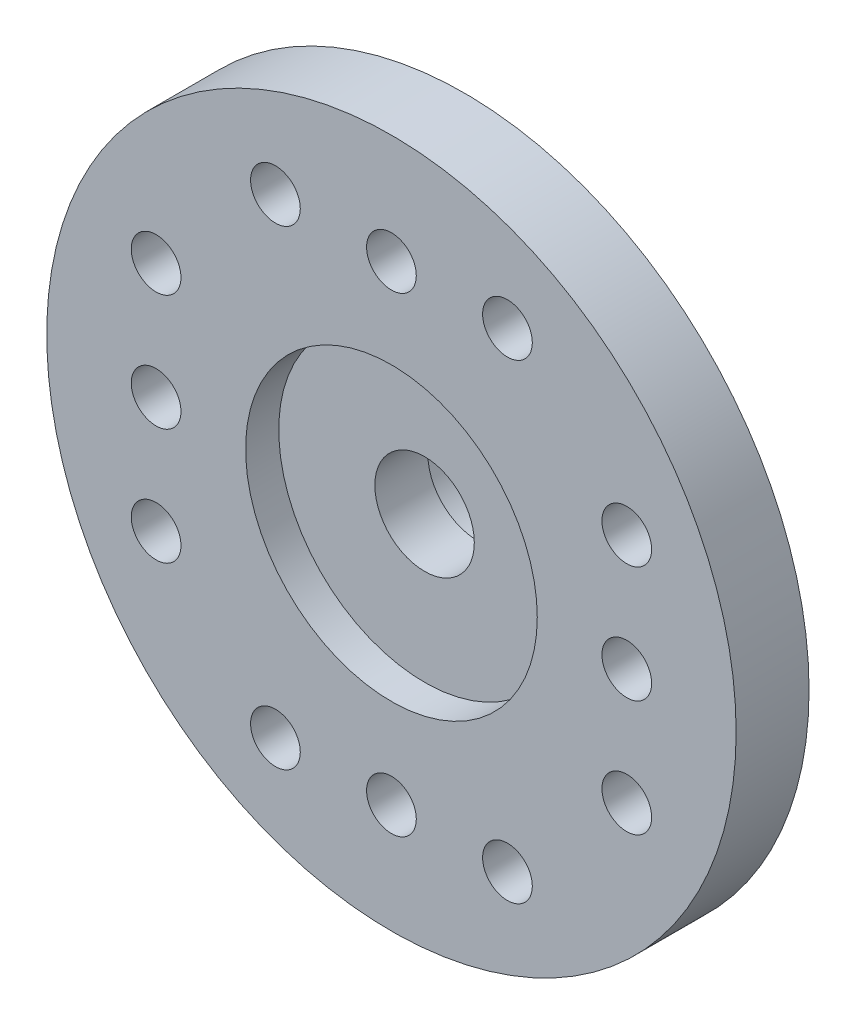
ISO-10303-21;
HEADER;
FILE_DESCRIPTION(('STEP AP214'),'2;1');
FILE_NAME('part.step','',(''),(''),'','','');
FILE_SCHEMA(('AUTOMOTIVE_DESIGN { 1 0 10303 214 1 1 1 1 }'));
ENDSEC;
DATA;
#1=APPLICATION_CONTEXT('core data for automotive mechanical design processes');
#2=APPLICATION_PROTOCOL_DEFINITION('international standard','automotive_design',2000,#1);
#3=PRODUCT_CONTEXT('',#1,'mechanical');
#4=PRODUCT('Part','Part','',(#3));
#5=PRODUCT_RELATED_PRODUCT_CATEGORY('part','',(#4));
#6=PRODUCT_DEFINITION_FORMATION('','',#4);
#7=PRODUCT_DEFINITION_CONTEXT('part definition',#1,'design');
#8=PRODUCT_DEFINITION('design','',#6,#7);
#9=PRODUCT_DEFINITION_SHAPE('','',#8);
#10=(LENGTH_UNIT() NAMED_UNIT(*) SI_UNIT(.MILLI.,.METRE.));
#11=(NAMED_UNIT(*) PLANE_ANGLE_UNIT() SI_UNIT($,.RADIAN.));
#12=(NAMED_UNIT(*) SI_UNIT($,.STERADIAN.) SOLID_ANGLE_UNIT());
#13=UNCERTAINTY_MEASURE_WITH_UNIT(LENGTH_MEASURE(1.E-05),#10,'distance_accuracy_value','');
#14=(GEOMETRIC_REPRESENTATION_CONTEXT(3) GLOBAL_UNCERTAINTY_ASSIGNED_CONTEXT((#13)) GLOBAL_UNIT_ASSIGNED_CONTEXT((#10,
#11,#12)) REPRESENTATION_CONTEXT('',''));
#15=CARTESIAN_POINT('',(0.,0.,0.));
#16=DIRECTION('',(0.,0.,1.));
#17=DIRECTION('',(1.,0.,0.));
#18=AXIS2_PLACEMENT_3D('',#15,#16,#17);
#19=CARTESIAN_POINT('',(0.,0.,2.2));
#20=DIRECTION('',(0.,0.,-1.));
#21=DIRECTION('',(-1.,0.,0.));
#22=AXIS2_PLACEMENT_3D('',#19,#20,#21);
#23=CYLINDRICAL_SURFACE('',#22,1.5);
#24=CARTESIAN_POINT('',(0.,0.,1.2));
#25=DIRECTION('',(0.,0.,1.));
#26=DIRECTION('',(1.,0.,0.));
#27=AXIS2_PLACEMENT_3D('',#24,#25,#26);
#28=CIRCLE('',#27,1.5);
#29=CARTESIAN_POINT('',(1.5,0.,1.2));
#30=VERTEX_POINT('',#29);
#31=EDGE_CURVE('E66',#30,#30,#28,.F.);
#32=ORIENTED_EDGE('',*,*,#31,.F.);
#33=EDGE_LOOP('',(#32));
#34=FACE_BOUND('',#33,.T.);
#35=CARTESIAN_POINT('',(0.,0.,-0.4));
#36=DIRECTION('',(0.,0.,-1.));
#37=DIRECTION('',(-1.,0.,0.));
#38=AXIS2_PLACEMENT_3D('',#35,#36,#37);
#39=CIRCLE('',#38,1.5);
#40=CARTESIAN_POINT('',(-1.5,0.,-0.4));
#41=VERTEX_POINT('',#40);
#42=EDGE_CURVE('E46',#41,#41,#39,.F.);
#43=ORIENTED_EDGE('',*,*,#42,.F.);
#44=EDGE_LOOP('',(#43));
#45=FACE_BOUND('',#44,.T.);
#46=ADVANCED_FACE('F42',(#34,#45),#23,.F.);
#47=CARTESIAN_POINT('',(0.,0.,2.2));
#48=DIRECTION('',(0.,0.,-1.));
#49=DIRECTION('',(-1.,0.,0.));
#50=AXIS2_PLACEMENT_3D('',#47,#48,#49);
#51=CYLINDRICAL_SURFACE('',#50,10.4);
#52=CARTESIAN_POINT('',(0.,0.,2.2));
#53=DIRECTION('',(0.,0.,1.));
#54=DIRECTION('',(1.,0.,0.));
#55=AXIS2_PLACEMENT_3D('',#52,#53,#54);
#56=CIRCLE('',#55,10.4);
#57=CARTESIAN_POINT('',(10.4,0.,2.2));
#58=VERTEX_POINT('',#57);
#59=EDGE_CURVE('E51',#58,#58,#56,.T.);
#60=ORIENTED_EDGE('',*,*,#59,.F.);
#61=EDGE_LOOP('',(#60));
#62=FACE_BOUND('',#61,.T.);
#63=CARTESIAN_POINT('',(0.,0.,0.));
#64=DIRECTION('',(0.,0.,1.));
#65=DIRECTION('',(1.,0.,0.));
#66=AXIS2_PLACEMENT_3D('',#63,#64,#65);
#67=CIRCLE('',#66,10.4);
#68=CARTESIAN_POINT('',(10.4,0.,0.));
#69=VERTEX_POINT('',#68);
#70=EDGE_CURVE('E57',#69,#69,#67,.T.);
#71=ORIENTED_EDGE('',*,*,#70,.T.);
#72=EDGE_LOOP('',(#71));
#73=FACE_BOUND('',#72,.T.);
#74=ADVANCED_FACE('F44',(#62,#73),#51,.T.);
#75=CARTESIAN_POINT('',(0.,0.,2.2));
#76=DIRECTION('',(0.,0.,1.));
#77=DIRECTION('',(1.,0.,0.));
#78=AXIS2_PLACEMENT_3D('',#75,#76,#77);
#79=PLANE('',#78);
#80=CARTESIAN_POINT('',(-7.1,-3.5,2.2));
#81=DIRECTION('',(0.,0.,1.));
#82=DIRECTION('',(1.,0.,0.));
#83=AXIS2_PLACEMENT_3D('',#80,#81,#82);
#84=CIRCLE('',#83,0.750000000000083);
#85=CARTESIAN_POINT('',(-6.34999999999991,-3.5,2.2));
#86=VERTEX_POINT('',#85);
#87=EDGE_CURVE('E133',#86,#86,#84,.T.);
#88=ORIENTED_EDGE('',*,*,#87,.F.);
#89=EDGE_LOOP('',(#88));
#90=FACE_BOUND('',#89,.T.);
#91=CARTESIAN_POINT('',(-7.1,3.5,2.2));
#92=DIRECTION('',(0.,0.,1.));
#93=DIRECTION('',(1.,0.,0.));
#94=AXIS2_PLACEMENT_3D('',#91,#92,#93);
#95=CIRCLE('',#94,0.75000000000006);
#96=CARTESIAN_POINT('',(-6.34999999999994,3.5,2.2));
#97=VERTEX_POINT('',#96);
#98=EDGE_CURVE('E137',#97,#97,#95,.T.);
#99=ORIENTED_EDGE('',*,*,#98,.F.);
#100=EDGE_LOOP('',(#99));
#101=FACE_BOUND('',#100,.T.);
#102=CARTESIAN_POINT('',(-7.1,0.,2.2));
#103=DIRECTION('',(0.,0.,1.));
#104=DIRECTION('',(1.,0.,0.));
#105=AXIS2_PLACEMENT_3D('',#102,#103,#104);
#106=CIRCLE('',#105,0.750000000000068);
#107=CARTESIAN_POINT('',(-6.34999999999993,0.,2.2));
#108=VERTEX_POINT('',#107);
#109=EDGE_CURVE('E141',#108,#108,#106,.T.);
#110=ORIENTED_EDGE('',*,*,#109,.F.);
#111=EDGE_LOOP('',(#110));
#112=FACE_BOUND('',#111,.T.);
#113=CARTESIAN_POINT('',(3.5,7.1,2.2));
#114=DIRECTION('',(0.,0.,1.));
#115=DIRECTION('',(1.,0.,0.));
#116=AXIS2_PLACEMENT_3D('',#113,#114,#115);
#117=CIRCLE('',#116,0.749999999999999);
#118=CARTESIAN_POINT('',(4.25,7.1,2.2));
#119=VERTEX_POINT('',#118);
#120=EDGE_CURVE('E132',#119,#119,#117,.T.);
#121=ORIENTED_EDGE('',*,*,#120,.F.);
#122=EDGE_LOOP('',(#121));
#123=FACE_BOUND('',#122,.T.);
#124=CARTESIAN_POINT('',(-3.5,7.1,2.2));
#125=DIRECTION('',(0.,0.,1.));
#126=DIRECTION('',(1.,0.,0.));
#127=AXIS2_PLACEMENT_3D('',#124,#125,#126);
#128=CIRCLE('',#127,0.75);
#129=CARTESIAN_POINT('',(-2.75,7.1,2.2));
#130=VERTEX_POINT('',#129);
#131=EDGE_CURVE('E155',#130,#130,#128,.T.);
#132=ORIENTED_EDGE('',*,*,#131,.F.);
#133=EDGE_LOOP('',(#132));
#134=FACE_BOUND('',#133,.T.);
#135=CARTESIAN_POINT('',(7.1,0.,2.2));
#136=DIRECTION('',(0.,0.,1.));
#137=DIRECTION('',(1.,0.,0.));
#138=AXIS2_PLACEMENT_3D('',#135,#136,#137);
#139=CIRCLE('',#138,0.75000000000002);
#140=CARTESIAN_POINT('',(7.85000000000002,0.,2.2));
#141=VERTEX_POINT('',#140);
#142=EDGE_CURVE('E150',#141,#141,#139,.T.);
#143=ORIENTED_EDGE('',*,*,#142,.F.);
#144=EDGE_LOOP('',(#143));
#145=FACE_BOUND('',#144,.T.);
#146=CARTESIAN_POINT('',(7.1,-3.5,2.2));
#147=DIRECTION('',(0.,0.,1.));
#148=DIRECTION('',(1.,0.,0.));
#149=AXIS2_PLACEMENT_3D('',#146,#147,#148);
#150=CIRCLE('',#149,0.750000000000019);
#151=CARTESIAN_POINT('',(7.85000000000002,-3.5,2.2));
#152=VERTEX_POINT('',#151);
#153=EDGE_CURVE('E146',#152,#152,#150,.T.);
#154=ORIENTED_EDGE('',*,*,#153,.F.);
#155=EDGE_LOOP('',(#154));
#156=FACE_BOUND('',#155,.T.);
#157=CARTESIAN_POINT('',(3.5,-7.1,2.2));
#158=DIRECTION('',(0.,0.,1.));
#159=DIRECTION('',(1.,0.,0.));
#160=AXIS2_PLACEMENT_3D('',#157,#158,#159);
#161=CIRCLE('',#160,0.750000000000055);
#162=CARTESIAN_POINT('',(4.25000000000006,-7.1,2.2));
#163=VERTEX_POINT('',#162);
#164=EDGE_CURVE('E145',#163,#163,#161,.T.);
#165=ORIENTED_EDGE('',*,*,#164,.F.);
#166=EDGE_LOOP('',(#165));
#167=FACE_BOUND('',#166,.T.);
#168=CARTESIAN_POINT('',(-3.5,-7.1,2.2));
#169=DIRECTION('',(0.,0.,1.));
#170=DIRECTION('',(1.,0.,0.));
#171=AXIS2_PLACEMENT_3D('',#168,#169,#170);
#172=CIRCLE('',#171,0.75000000000004);
#173=CARTESIAN_POINT('',(-2.74999999999996,-7.1,2.2));
#174=VERTEX_POINT('',#173);
#175=EDGE_CURVE('E166',#174,#174,#172,.T.);
#176=ORIENTED_EDGE('',*,*,#175,.F.);
#177=EDGE_LOOP('',(#176));
#178=FACE_BOUND('',#177,.T.);
#179=CARTESIAN_POINT('',(0.,-7.1,2.2));
#180=DIRECTION('',(0.,0.,1.));
#181=DIRECTION('',(1.,0.,0.));
#182=AXIS2_PLACEMENT_3D('',#179,#180,#181);
#183=CIRCLE('',#182,0.750000000000044);
#184=CARTESIAN_POINT('',(0.750000000000045,-7.1,2.2));
#185=VERTEX_POINT('',#184);
#186=EDGE_CURVE('E162',#185,#185,#183,.T.);
#187=ORIENTED_EDGE('',*,*,#186,.F.);
#188=EDGE_LOOP('',(#187));
#189=FACE_BOUND('',#188,.T.);
#190=CARTESIAN_POINT('',(7.1,3.5,2.2));
#191=DIRECTION('',(0.,0.,1.));
#192=DIRECTION('',(1.,0.,0.));
#193=AXIS2_PLACEMENT_3D('',#190,#191,#192);
#194=CIRCLE('',#193,0.750000000000027);
#195=CARTESIAN_POINT('',(7.85000000000002,3.5,2.2));
#196=VERTEX_POINT('',#195);
#197=EDGE_CURVE('E151',#196,#196,#194,.T.);
#198=ORIENTED_EDGE('',*,*,#197,.F.);
#199=EDGE_LOOP('',(#198));
#200=FACE_BOUND('',#199,.T.);
#201=CARTESIAN_POINT('',(0.,7.1,2.2));
#202=DIRECTION('',(0.,0.,1.));
#203=DIRECTION('',(1.,0.,0.));
#204=AXIS2_PLACEMENT_3D('',#201,#202,#203);
#205=CIRCLE('',#204,0.75);
#206=CARTESIAN_POINT('',(0.749999999999996,7.1,2.2));
#207=VERTEX_POINT('',#206);
#208=EDGE_CURVE('E76',#207,#207,#205,.T.);
#209=ORIENTED_EDGE('',*,*,#208,.F.);
#210=EDGE_LOOP('',(#209));
#211=FACE_BOUND('',#210,.T.);
#212=CARTESIAN_POINT('',(0.,0.,2.2));
#213=DIRECTION('',(0.,0.,1.));
#214=DIRECTION('',(1.,0.,0.));
#215=AXIS2_PLACEMENT_3D('',#212,#213,#214);
#216=CIRCLE('',#215,4.4);
#217=CARTESIAN_POINT('',(4.4,0.,2.2));
#218=VERTEX_POINT('',#217);
#219=EDGE_CURVE('E118',#218,#218,#216,.T.);
#220=ORIENTED_EDGE('',*,*,#219,.F.);
#221=EDGE_LOOP('',(#220));
#222=FACE_BOUND('',#221,.T.);
#223=ORIENTED_EDGE('',*,*,#59,.T.);
#224=EDGE_LOOP('',(#223));
#225=FACE_BOUND('',#224,.T.);
#226=ADVANCED_FACE('F197',(#90,#101,#112,#123,#134,#145,#156,#167,#178,#189,#200,#211,#222,
#225),#79,.T.);
#227=CARTESIAN_POINT('',(0.,0.,0.));
#228=DIRECTION('',(0.,0.,1.));
#229=DIRECTION('',(1.,0.,0.));
#230=AXIS2_PLACEMENT_3D('',#227,#228,#229);
#231=PLANE('',#230);
#232=CARTESIAN_POINT('',(-7.1,-3.5,0.));
#233=DIRECTION('',(0.,0.,1.));
#234=DIRECTION('',(1.,0.,0.));
#235=AXIS2_PLACEMENT_3D('',#232,#233,#234);
#236=CIRCLE('',#235,0.750000000000083);
#237=CARTESIAN_POINT('',(-6.34999999999991,-3.5,0.));
#238=VERTEX_POINT('',#237);
#239=EDGE_CURVE('E115',#238,#238,#236,.T.);
#240=ORIENTED_EDGE('',*,*,#239,.T.);
#241=EDGE_LOOP('',(#240));
#242=FACE_BOUND('',#241,.T.);
#243=CARTESIAN_POINT('',(-7.1,3.5,0.));
#244=DIRECTION('',(0.,0.,1.));
#245=DIRECTION('',(1.,0.,0.));
#246=AXIS2_PLACEMENT_3D('',#243,#244,#245);
#247=CIRCLE('',#246,0.75000000000006);
#248=CARTESIAN_POINT('',(-6.34999999999994,3.5,0.));
#249=VERTEX_POINT('',#248);
#250=EDGE_CURVE('E112',#249,#249,#247,.T.);
#251=ORIENTED_EDGE('',*,*,#250,.T.);
#252=EDGE_LOOP('',(#251));
#253=FACE_BOUND('',#252,.T.);
#254=CARTESIAN_POINT('',(-7.1,0.,0.));
#255=DIRECTION('',(0.,0.,1.));
#256=DIRECTION('',(1.,0.,0.));
#257=AXIS2_PLACEMENT_3D('',#254,#255,#256);
#258=CIRCLE('',#257,0.750000000000068);
#259=CARTESIAN_POINT('',(-6.34999999999993,0.,0.));
#260=VERTEX_POINT('',#259);
#261=EDGE_CURVE('E108',#260,#260,#258,.T.);
#262=ORIENTED_EDGE('',*,*,#261,.T.);
#263=EDGE_LOOP('',(#262));
#264=FACE_BOUND('',#263,.T.);
#265=CARTESIAN_POINT('',(3.5,7.1,0.));
#266=DIRECTION('',(0.,0.,1.));
#267=DIRECTION('',(1.,0.,0.));
#268=AXIS2_PLACEMENT_3D('',#265,#266,#267);
#269=CIRCLE('',#268,0.749999999999999);
#270=CARTESIAN_POINT('',(4.25,7.1,0.));
#271=VERTEX_POINT('',#270);
#272=EDGE_CURVE('E104',#271,#271,#269,.T.);
#273=ORIENTED_EDGE('',*,*,#272,.T.);
#274=EDGE_LOOP('',(#273));
#275=FACE_BOUND('',#274,.T.);
#276=CARTESIAN_POINT('',(-3.5,7.1,0.));
#277=DIRECTION('',(0.,0.,1.));
#278=DIRECTION('',(1.,0.,0.));
#279=AXIS2_PLACEMENT_3D('',#276,#277,#278);
#280=CIRCLE('',#279,0.75);
#281=CARTESIAN_POINT('',(-2.75,7.1,0.));
#282=VERTEX_POINT('',#281);
#283=EDGE_CURVE('E100',#282,#282,#280,.T.);
#284=ORIENTED_EDGE('',*,*,#283,.T.);
#285=EDGE_LOOP('',(#284));
#286=FACE_BOUND('',#285,.T.);
#287=CARTESIAN_POINT('',(7.1,0.,0.));
#288=DIRECTION('',(0.,0.,1.));
#289=DIRECTION('',(1.,0.,0.));
#290=AXIS2_PLACEMENT_3D('',#287,#288,#289);
#291=CIRCLE('',#290,0.75000000000002);
#292=CARTESIAN_POINT('',(7.85000000000002,0.,0.));
#293=VERTEX_POINT('',#292);
#294=EDGE_CURVE('E96',#293,#293,#291,.T.);
#295=ORIENTED_EDGE('',*,*,#294,.T.);
#296=EDGE_LOOP('',(#295));
#297=FACE_BOUND('',#296,.T.);
#298=CARTESIAN_POINT('',(7.1,-3.5,0.));
#299=DIRECTION('',(0.,0.,1.));
#300=DIRECTION('',(1.,0.,0.));
#301=AXIS2_PLACEMENT_3D('',#298,#299,#300);
#302=CIRCLE('',#301,0.750000000000019);
#303=CARTESIAN_POINT('',(7.85000000000002,-3.5,0.));
#304=VERTEX_POINT('',#303);
#305=EDGE_CURVE('E92',#304,#304,#302,.T.);
#306=ORIENTED_EDGE('',*,*,#305,.T.);
#307=EDGE_LOOP('',(#306));
#308=FACE_BOUND('',#307,.T.);
#309=CARTESIAN_POINT('',(3.5,-7.1,0.));
#310=DIRECTION('',(0.,0.,1.));
#311=DIRECTION('',(1.,0.,0.));
#312=AXIS2_PLACEMENT_3D('',#309,#310,#311);
#313=CIRCLE('',#312,0.750000000000055);
#314=CARTESIAN_POINT('',(4.25000000000006,-7.1,0.));
#315=VERTEX_POINT('',#314);
#316=EDGE_CURVE('E88',#315,#315,#313,.T.);
#317=ORIENTED_EDGE('',*,*,#316,.T.);
#318=EDGE_LOOP('',(#317));
#319=FACE_BOUND('',#318,.T.);
#320=CARTESIAN_POINT('',(-3.5,-7.1,0.));
#321=DIRECTION('',(0.,0.,1.));
#322=DIRECTION('',(1.,0.,0.));
#323=AXIS2_PLACEMENT_3D('',#320,#321,#322);
#324=CIRCLE('',#323,0.75000000000004);
#325=CARTESIAN_POINT('',(-2.74999999999996,-7.1,0.));
#326=VERTEX_POINT('',#325);
#327=EDGE_CURVE('E84',#326,#326,#324,.T.);
#328=ORIENTED_EDGE('',*,*,#327,.T.);
#329=EDGE_LOOP('',(#328));
#330=FACE_BOUND('',#329,.T.);
#331=CARTESIAN_POINT('',(0.,-7.1,0.));
#332=DIRECTION('',(0.,0.,1.));
#333=DIRECTION('',(1.,0.,0.));
#334=AXIS2_PLACEMENT_3D('',#331,#332,#333);
#335=CIRCLE('',#334,0.750000000000044);
#336=CARTESIAN_POINT('',(0.750000000000045,-7.1,0.));
#337=VERTEX_POINT('',#336);
#338=EDGE_CURVE('E80',#337,#337,#335,.T.);
#339=ORIENTED_EDGE('',*,*,#338,.T.);
#340=EDGE_LOOP('',(#339));
#341=FACE_BOUND('',#340,.T.);
#342=CARTESIAN_POINT('',(7.1,3.5,0.));
#343=DIRECTION('',(0.,0.,1.));
#344=DIRECTION('',(1.,0.,0.));
#345=AXIS2_PLACEMENT_3D('',#342,#343,#344);
#346=CIRCLE('',#345,0.750000000000027);
#347=CARTESIAN_POINT('',(7.85000000000002,3.5,0.));
#348=VERTEX_POINT('',#347);
#349=EDGE_CURVE('E75',#348,#348,#346,.T.);
#350=ORIENTED_EDGE('',*,*,#349,.T.);
#351=EDGE_LOOP('',(#350));
#352=FACE_BOUND('',#351,.T.);
#353=CARTESIAN_POINT('',(0.,7.1,0.));
#354=DIRECTION('',(0.,0.,1.));
#355=DIRECTION('',(1.,0.,0.));
#356=AXIS2_PLACEMENT_3D('',#353,#354,#355);
#357=CIRCLE('',#356,0.75);
#358=CARTESIAN_POINT('',(0.749999999999996,7.1,0.));
#359=VERTEX_POINT('',#358);
#360=EDGE_CURVE('E71',#359,#359,#357,.T.);
#361=ORIENTED_EDGE('',*,*,#360,.T.);
#362=EDGE_LOOP('',(#361));
#363=FACE_BOUND('',#362,.T.);
#364=CARTESIAN_POINT('',(0.,0.,0.));
#365=DIRECTION('',(0.,0.,-1.));
#366=DIRECTION('',(-1.,0.,0.));
#367=AXIS2_PLACEMENT_3D('',#364,#365,#366);
#368=CIRCLE('',#367,4.35);
#369=CARTESIAN_POINT('',(-4.35,0.,0.));
#370=VERTEX_POINT('',#369);
#371=EDGE_CURVE('E10',#370,#370,#368,.T.);
#372=ORIENTED_EDGE('',*,*,#371,.F.);
#373=EDGE_LOOP('',(#372));
#374=FACE_BOUND('',#373,.T.);
#375=ORIENTED_EDGE('',*,*,#70,.F.);
#376=EDGE_LOOP('',(#375));
#377=FACE_BOUND('',#376,.T.);
#378=ADVANCED_FACE('F212',(#242,#253,#264,#275,#286,#297,#308,#319,#330,#341,#352,#363,#374,
#377),#231,.F.);
#379=CARTESIAN_POINT('',(0.,0.,-3.3));
#380=DIRECTION('',(0.,0.,1.));
#381=DIRECTION('',(1.,0.,0.));
#382=AXIS2_PLACEMENT_3D('',#379,#380,#381);
#383=CYLINDRICAL_SURFACE('',#382,4.35);
#384=CARTESIAN_POINT('',(0.,0.,-3.3));
#385=DIRECTION('',(0.,0.,-1.));
#386=DIRECTION('',(-1.,0.,0.));
#387=AXIS2_PLACEMENT_3D('',#384,#385,#386);
#388=CIRCLE('',#387,4.35);
#389=CARTESIAN_POINT('',(-4.35,0.,-3.3));
#390=VERTEX_POINT('',#389);
#391=EDGE_CURVE('E60',#390,#390,#388,.T.);
#392=ORIENTED_EDGE('',*,*,#391,.F.);
#393=EDGE_LOOP('',(#392));
#394=FACE_BOUND('',#393,.T.);
#395=ORIENTED_EDGE('',*,*,#371,.T.);
#396=EDGE_LOOP('',(#395));
#397=FACE_BOUND('',#396,.T.);
#398=ADVANCED_FACE('F208',(#394,#397),#383,.T.);
#399=CARTESIAN_POINT('',(0.,0.,-3.3));
#400=DIRECTION('',(0.,0.,-1.));
#401=DIRECTION('',(-1.,0.,0.));
#402=AXIS2_PLACEMENT_3D('',#399,#400,#401);
#403=PLANE('',#402);
#404=CARTESIAN_POINT('',(0.,0.,-3.3));
#405=DIRECTION('',(0.,0.,-1.));
#406=DIRECTION('',(-1.,0.,0.));
#407=AXIS2_PLACEMENT_3D('',#404,#405,#406);
#408=CIRCLE('',#407,2.);
#409=CARTESIAN_POINT('',(-2.,0.,-3.3));
#410=VERTEX_POINT('',#409);
#411=EDGE_CURVE('E176',#410,#410,#408,.T.);
#412=ORIENTED_EDGE('',*,*,#411,.F.);
#413=EDGE_LOOP('',(#412));
#414=FACE_BOUND('',#413,.T.);
#415=ORIENTED_EDGE('',*,*,#391,.T.);
#416=EDGE_LOOP('',(#415));
#417=FACE_BOUND('',#416,.T.);
#418=ADVANCED_FACE('F204',(#414,#417),#403,.T.);
#419=CARTESIAN_POINT('',(0.,0.,1.2));
#420=DIRECTION('',(0.,0.,1.));
#421=DIRECTION('',(1.,0.,0.));
#422=AXIS2_PLACEMENT_3D('',#419,#420,#421);
#423=PLANE('',#422);
#424=CARTESIAN_POINT('',(0.,0.,1.2));
#425=DIRECTION('',(0.,0.,1.));
#426=DIRECTION('',(1.,0.,0.));
#427=AXIS2_PLACEMENT_3D('',#424,#425,#426);
#428=CIRCLE('',#427,4.4);
#429=CARTESIAN_POINT('',(4.4,0.,1.2));
#430=VERTEX_POINT('',#429);
#431=EDGE_CURVE('E70',#430,#430,#428,.T.);
#432=ORIENTED_EDGE('',*,*,#431,.T.);
#433=EDGE_LOOP('',(#432));
#434=FACE_BOUND('',#433,.T.);
#435=ORIENTED_EDGE('',*,*,#31,.T.);
#436=EDGE_LOOP('',(#435));
#437=FACE_BOUND('',#436,.T.);
#438=ADVANCED_FACE('F207',(#434,#437),#423,.T.);
#439=CARTESIAN_POINT('',(0.,0.,1.2));
#440=DIRECTION('',(0.,0.,1.));
#441=DIRECTION('',(1.,0.,0.));
#442=AXIS2_PLACEMENT_3D('',#439,#440,#441);
#443=CYLINDRICAL_SURFACE('',#442,4.4);
#444=ORIENTED_EDGE('',*,*,#431,.F.);
#445=EDGE_LOOP('',(#444));
#446=FACE_BOUND('',#445,.T.);
#447=ORIENTED_EDGE('',*,*,#219,.T.);
#448=EDGE_LOOP('',(#447));
#449=FACE_BOUND('',#448,.T.);
#450=ADVANCED_FACE('F202',(#446,#449),#443,.F.);
#451=CARTESIAN_POINT('',(0.,7.1,-3.3));
#452=DIRECTION('',(0.,0.,1.));
#453=DIRECTION('',(1.,0.,0.));
#454=AXIS2_PLACEMENT_3D('',#451,#452,#453);
#455=CYLINDRICAL_SURFACE('',#454,0.75);
#456=ORIENTED_EDGE('',*,*,#208,.T.);
#457=EDGE_LOOP('',(#456));
#458=FACE_BOUND('',#457,.T.);
#459=ORIENTED_EDGE('',*,*,#360,.F.);
#460=EDGE_LOOP('',(#459));
#461=FACE_BOUND('',#460,.T.);
#462=ADVANCED_FACE('F246',(#458,#461),#455,.F.);
#463=CARTESIAN_POINT('',(7.1,3.5,-3.3));
#464=DIRECTION('',(0.,0.,1.));
#465=DIRECTION('',(1.,0.,0.));
#466=AXIS2_PLACEMENT_3D('',#463,#464,#465);
#467=CYLINDRICAL_SURFACE('',#466,0.750000000000027);
#468=ORIENTED_EDGE('',*,*,#197,.T.);
#469=EDGE_LOOP('',(#468));
#470=FACE_BOUND('',#469,.T.);
#471=ORIENTED_EDGE('',*,*,#349,.F.);
#472=EDGE_LOOP('',(#471));
#473=FACE_BOUND('',#472,.T.);
#474=ADVANCED_FACE('F248',(#470,#473),#467,.F.);
#475=CARTESIAN_POINT('',(0.,-7.1,-3.3));
#476=DIRECTION('',(0.,0.,1.));
#477=DIRECTION('',(1.,0.,0.));
#478=AXIS2_PLACEMENT_3D('',#475,#476,#477);
#479=CYLINDRICAL_SURFACE('',#478,0.750000000000044);
#480=ORIENTED_EDGE('',*,*,#186,.T.);
#481=EDGE_LOOP('',(#480));
#482=FACE_BOUND('',#481,.T.);
#483=ORIENTED_EDGE('',*,*,#338,.F.);
#484=EDGE_LOOP('',(#483));
#485=FACE_BOUND('',#484,.T.);
#486=ADVANCED_FACE('F255',(#482,#485),#479,.F.);
#487=CARTESIAN_POINT('',(-3.5,-7.1,-3.3));
#488=DIRECTION('',(0.,0.,1.));
#489=DIRECTION('',(1.,0.,0.));
#490=AXIS2_PLACEMENT_3D('',#487,#488,#489);
#491=CYLINDRICAL_SURFACE('',#490,0.75000000000004);
#492=ORIENTED_EDGE('',*,*,#175,.T.);
#493=EDGE_LOOP('',(#492));
#494=FACE_BOUND('',#493,.T.);
#495=ORIENTED_EDGE('',*,*,#327,.F.);
#496=EDGE_LOOP('',(#495));
#497=FACE_BOUND('',#496,.T.);
#498=ADVANCED_FACE('F311',(#494,#497),#491,.F.);
#499=CARTESIAN_POINT('',(3.5,-7.1,-3.3));
#500=DIRECTION('',(0.,0.,1.));
#501=DIRECTION('',(1.,0.,0.));
#502=AXIS2_PLACEMENT_3D('',#499,#500,#501);
#503=CYLINDRICAL_SURFACE('',#502,0.750000000000055);
#504=ORIENTED_EDGE('',*,*,#164,.T.);
#505=EDGE_LOOP('',(#504));
#506=FACE_BOUND('',#505,.T.);
#507=ORIENTED_EDGE('',*,*,#316,.F.);
#508=EDGE_LOOP('',(#507));
#509=FACE_BOUND('',#508,.T.);
#510=ADVANCED_FACE('F322',(#506,#509),#503,.F.);
#511=CARTESIAN_POINT('',(7.1,-3.5,-3.3));
#512=DIRECTION('',(0.,0.,1.));
#513=DIRECTION('',(1.,0.,0.));
#514=AXIS2_PLACEMENT_3D('',#511,#512,#513);
#515=CYLINDRICAL_SURFACE('',#514,0.750000000000019);
#516=ORIENTED_EDGE('',*,*,#153,.T.);
#517=EDGE_LOOP('',(#516));
#518=FACE_BOUND('',#517,.T.);
#519=ORIENTED_EDGE('',*,*,#305,.F.);
#520=EDGE_LOOP('',(#519));
#521=FACE_BOUND('',#520,.T.);
#522=ADVANCED_FACE('F333',(#518,#521),#515,.F.);
#523=CARTESIAN_POINT('',(7.1,0.,-3.3));
#524=DIRECTION('',(0.,0.,1.));
#525=DIRECTION('',(1.,0.,0.));
#526=AXIS2_PLACEMENT_3D('',#523,#524,#525);
#527=CYLINDRICAL_SURFACE('',#526,0.75000000000002);
#528=ORIENTED_EDGE('',*,*,#142,.T.);
#529=EDGE_LOOP('',(#528));
#530=FACE_BOUND('',#529,.T.);
#531=ORIENTED_EDGE('',*,*,#294,.F.);
#532=EDGE_LOOP('',(#531));
#533=FACE_BOUND('',#532,.T.);
#534=ADVANCED_FACE('F344',(#530,#533),#527,.F.);
#535=CARTESIAN_POINT('',(-3.5,7.1,-3.3));
#536=DIRECTION('',(0.,0.,1.));
#537=DIRECTION('',(1.,0.,0.));
#538=AXIS2_PLACEMENT_3D('',#535,#536,#537);
#539=CYLINDRICAL_SURFACE('',#538,0.75);
#540=ORIENTED_EDGE('',*,*,#131,.T.);
#541=EDGE_LOOP('',(#540));
#542=FACE_BOUND('',#541,.T.);
#543=ORIENTED_EDGE('',*,*,#283,.F.);
#544=EDGE_LOOP('',(#543));
#545=FACE_BOUND('',#544,.T.);
#546=ADVANCED_FACE('F355',(#542,#545),#539,.F.);
#547=CARTESIAN_POINT('',(3.5,7.1,-3.3));
#548=DIRECTION('',(0.,0.,1.));
#549=DIRECTION('',(1.,0.,0.));
#550=AXIS2_PLACEMENT_3D('',#547,#548,#549);
#551=CYLINDRICAL_SURFACE('',#550,0.749999999999999);
#552=ORIENTED_EDGE('',*,*,#120,.T.);
#553=EDGE_LOOP('',(#552));
#554=FACE_BOUND('',#553,.T.);
#555=ORIENTED_EDGE('',*,*,#272,.F.);
#556=EDGE_LOOP('',(#555));
#557=FACE_BOUND('',#556,.T.);
#558=ADVANCED_FACE('F366',(#554,#557),#551,.F.);
#559=CARTESIAN_POINT('',(-7.1,0.,-3.3));
#560=DIRECTION('',(0.,0.,1.));
#561=DIRECTION('',(1.,0.,0.));
#562=AXIS2_PLACEMENT_3D('',#559,#560,#561);
#563=CYLINDRICAL_SURFACE('',#562,0.750000000000068);
#564=ORIENTED_EDGE('',*,*,#109,.T.);
#565=EDGE_LOOP('',(#564));
#566=FACE_BOUND('',#565,.T.);
#567=ORIENTED_EDGE('',*,*,#261,.F.);
#568=EDGE_LOOP('',(#567));
#569=FACE_BOUND('',#568,.T.);
#570=ADVANCED_FACE('F377',(#566,#569),#563,.F.);
#571=CARTESIAN_POINT('',(-7.1,3.5,-3.3));
#572=DIRECTION('',(0.,0.,1.));
#573=DIRECTION('',(1.,0.,0.));
#574=AXIS2_PLACEMENT_3D('',#571,#572,#573);
#575=CYLINDRICAL_SURFACE('',#574,0.75000000000006);
#576=ORIENTED_EDGE('',*,*,#98,.T.);
#577=EDGE_LOOP('',(#576));
#578=FACE_BOUND('',#577,.T.);
#579=ORIENTED_EDGE('',*,*,#250,.F.);
#580=EDGE_LOOP('',(#579));
#581=FACE_BOUND('',#580,.T.);
#582=ADVANCED_FACE('F388',(#578,#581),#575,.F.);
#583=CARTESIAN_POINT('',(-7.1,-3.5,-3.3));
#584=DIRECTION('',(0.,0.,1.));
#585=DIRECTION('',(1.,0.,0.));
#586=AXIS2_PLACEMENT_3D('',#583,#584,#585);
#587=CYLINDRICAL_SURFACE('',#586,0.750000000000083);
#588=ORIENTED_EDGE('',*,*,#87,.T.);
#589=EDGE_LOOP('',(#588));
#590=FACE_BOUND('',#589,.T.);
#591=ORIENTED_EDGE('',*,*,#239,.F.);
#592=EDGE_LOOP('',(#591));
#593=FACE_BOUND('',#592,.T.);
#594=ADVANCED_FACE('F260',(#590,#593),#587,.F.);
#595=CARTESIAN_POINT('',(0.,0.,-0.4));
#596=DIRECTION('',(0.,0.,-1.));
#597=DIRECTION('',(-1.,0.,0.));
#598=AXIS2_PLACEMENT_3D('',#595,#596,#597);
#599=PLANE('',#598);
#600=CARTESIAN_POINT('',(0.,0.,-0.4));
#601=DIRECTION('',(0.,0.,-1.));
#602=DIRECTION('',(-1.,0.,0.));
#603=AXIS2_PLACEMENT_3D('',#600,#601,#602);
#604=CIRCLE('',#603,2.);
#605=CARTESIAN_POINT('',(-2.,0.,-0.4));
#606=VERTEX_POINT('',#605);
#607=EDGE_CURVE('E180',#606,#606,#604,.T.);
#608=ORIENTED_EDGE('',*,*,#607,.T.);
#609=EDGE_LOOP('',(#608));
#610=FACE_BOUND('',#609,.T.);
#611=ORIENTED_EDGE('',*,*,#42,.T.);
#612=EDGE_LOOP('',(#611));
#613=FACE_BOUND('',#612,.T.);
#614=ADVANCED_FACE('F189',(#610,#613),#599,.T.);
#615=CARTESIAN_POINT('',(0.,0.,-0.4));
#616=DIRECTION('',(0.,0.,-1.));
#617=DIRECTION('',(-1.,0.,0.));
#618=AXIS2_PLACEMENT_3D('',#615,#616,#617);
#619=CYLINDRICAL_SURFACE('',#618,2.);
#620=ORIENTED_EDGE('',*,*,#607,.F.);
#621=EDGE_LOOP('',(#620));
#622=FACE_BOUND('',#621,.T.);
#623=ORIENTED_EDGE('',*,*,#411,.T.);
#624=EDGE_LOOP('',(#623));
#625=FACE_BOUND('',#624,.T.);
#626=ADVANCED_FACE('F427',(#622,#625),#619,.F.);
#627=CLOSED_SHELL('',(#46,#74,#226,#378,#398,#418,#438,#450,#462,#474,#486,#498,#510,#522,#534,
#546,#558,#570,#582,#594,#614,#626));
#628=MANIFOLD_SOLID_BREP('B2',#627);
#629=ADVANCED_BREP_SHAPE_REPRESENTATION('',(#18,#628),#14);
#630=SHAPE_DEFINITION_REPRESENTATION(#9,#629);
ENDSEC;
END-ISO-10303-21;
